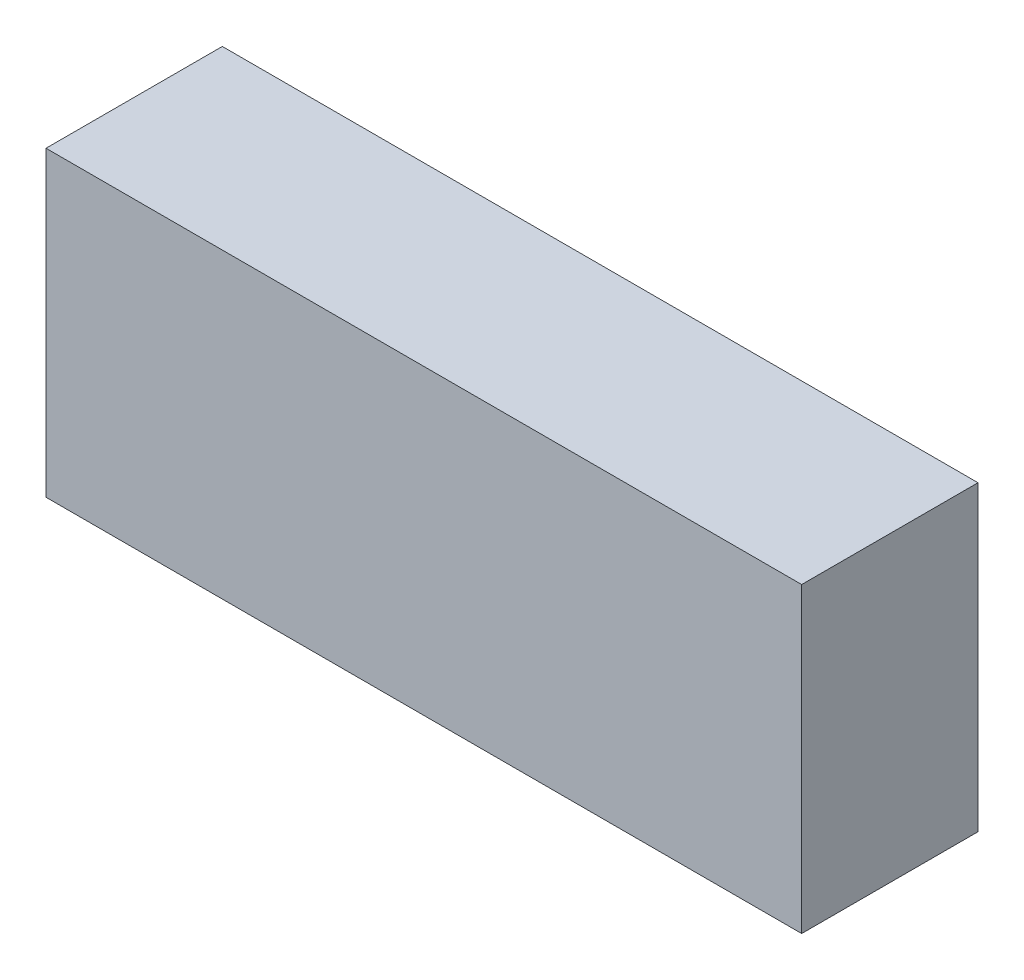
ISO-10303-21;
HEADER;
FILE_DESCRIPTION(('STEP AP214'),'2;1');
FILE_NAME('part.step','',(''),(''),'','','');
FILE_SCHEMA(('AUTOMOTIVE_DESIGN { 1 0 10303 214 1 1 1 1 }'));
ENDSEC;
DATA;
#1=APPLICATION_CONTEXT('core data for automotive mechanical design processes');
#2=APPLICATION_PROTOCOL_DEFINITION('international standard','automotive_design',2000,#1);
#3=PRODUCT_CONTEXT('',#1,'mechanical');
#4=PRODUCT('Part','Part','',(#3));
#5=PRODUCT_RELATED_PRODUCT_CATEGORY('part','',(#4));
#6=PRODUCT_DEFINITION_FORMATION('','',#4);
#7=PRODUCT_DEFINITION_CONTEXT('part definition',#1,'design');
#8=PRODUCT_DEFINITION('design','',#6,#7);
#9=PRODUCT_DEFINITION_SHAPE('','',#8);
#10=(LENGTH_UNIT() NAMED_UNIT(*) SI_UNIT(.MILLI.,.METRE.));
#11=(NAMED_UNIT(*) PLANE_ANGLE_UNIT() SI_UNIT($,.RADIAN.));
#12=(NAMED_UNIT(*) SI_UNIT($,.STERADIAN.) SOLID_ANGLE_UNIT());
#13=UNCERTAINTY_MEASURE_WITH_UNIT(LENGTH_MEASURE(1.E-05),#10,'distance_accuracy_value','');
#14=(GEOMETRIC_REPRESENTATION_CONTEXT(3) GLOBAL_UNCERTAINTY_ASSIGNED_CONTEXT((#13)) GLOBAL_UNIT_ASSIGNED_CONTEXT((#10,
#11,#12)) REPRESENTATION_CONTEXT('',''));
#15=CARTESIAN_POINT('',(0.,0.,0.));
#16=DIRECTION('',(0.,0.,1.));
#17=DIRECTION('',(1.,0.,0.));
#18=AXIS2_PLACEMENT_3D('',#15,#16,#17);
#19=CARTESIAN_POINT('',(-3.81,1.52400254,1.778));
#20=DIRECTION('',(0.,0.,1.));
#21=DIRECTION('',(1.,0.,0.));
#22=AXIS2_PLACEMENT_3D('',#19,#20,#21);
#23=PLANE('',#22);
#24=DIRECTION('',(0.,1.,0.));
#25=VECTOR('',#24,1.);
#26=CARTESIAN_POINT('',(3.81,1.52400254,1.778));
#27=LINE('',#26,#25);
#28=CARTESIAN_POINT('',(3.81,1.52400254,1.778));
#29=VERTEX_POINT('',#28);
#30=CARTESIAN_POINT('',(3.81,-1.52400254,1.778));
#31=VERTEX_POINT('',#30);
#32=EDGE_CURVE('E53',#29,#31,#27,.F.);
#33=ORIENTED_EDGE('',*,*,#32,.F.);
#34=DIRECTION('',(1.,0.,0.));
#35=VECTOR('',#34,1.);
#36=CARTESIAN_POINT('',(-3.81,1.52400254,1.778));
#37=LINE('',#36,#35);
#38=CARTESIAN_POINT('',(-3.81,1.52400254,1.778));
#39=VERTEX_POINT('',#38);
#40=EDGE_CURVE('E68',#39,#29,#37,.T.);
#41=ORIENTED_EDGE('',*,*,#40,.F.);
#42=DIRECTION('',(0.,1.,0.));
#43=VECTOR('',#42,1.);
#44=CARTESIAN_POINT('',(-3.81,-1.52400254,1.778));
#45=LINE('',#44,#43);
#46=CARTESIAN_POINT('',(-3.81,-1.52400254,1.778));
#47=VERTEX_POINT('',#46);
#48=EDGE_CURVE('E20',#47,#39,#45,.T.);
#49=ORIENTED_EDGE('',*,*,#48,.F.);
#50=DIRECTION('',(1.,0.,0.));
#51=VECTOR('',#50,1.);
#52=CARTESIAN_POINT('',(3.81,-1.52400254,1.778));
#53=LINE('',#52,#51);
#54=EDGE_CURVE('E58',#31,#47,#53,.F.);
#55=ORIENTED_EDGE('',*,*,#54,.F.);
#56=EDGE_LOOP('',(#33,#41,#49,#55));
#57=FACE_BOUND('',#56,.T.);
#58=ADVANCED_FACE('F17',(#57),#23,.T.);
#59=CARTESIAN_POINT('',(-3.81,-1.52400254,0.));
#60=DIRECTION('',(-1.,0.,0.));
#61=DIRECTION('',(0.,0.,1.));
#62=AXIS2_PLACEMENT_3D('',#59,#60,#61);
#63=PLANE('',#62);
#64=DIRECTION('',(0.,0.,1.));
#65=VECTOR('',#64,1.);
#66=CARTESIAN_POINT('',(-3.81,1.52400254,0.));
#67=LINE('',#66,#65);
#68=CARTESIAN_POINT('',(-3.81,1.52400254,0.));
#69=VERTEX_POINT('',#68);
#70=EDGE_CURVE('E79',#69,#39,#67,.T.);
#71=ORIENTED_EDGE('',*,*,#70,.F.);
#72=DIRECTION('',(0.,1.,0.));
#73=VECTOR('',#72,1.);
#74=CARTESIAN_POINT('',(-3.81,1.52400254,0.));
#75=LINE('',#74,#73);
#76=CARTESIAN_POINT('',(-3.81,-1.52400254,0.));
#77=VERTEX_POINT('',#76);
#78=EDGE_CURVE('E74',#69,#77,#75,.F.);
#79=ORIENTED_EDGE('',*,*,#78,.T.);
#80=DIRECTION('',(0.,0.,-1.));
#81=VECTOR('',#80,1.);
#82=CARTESIAN_POINT('',(-3.81,-1.52400254,0.));
#83=LINE('',#82,#81);
#84=EDGE_CURVE('E63',#47,#77,#83,.T.);
#85=ORIENTED_EDGE('',*,*,#84,.F.);
#86=ORIENTED_EDGE('',*,*,#48,.T.);
#87=EDGE_LOOP('',(#71,#79,#85,#86));
#88=FACE_BOUND('',#87,.T.);
#89=ADVANCED_FACE('F73',(#88),#63,.T.);
#90=CARTESIAN_POINT('',(3.81,-1.52400254,0.));
#91=DIRECTION('',(0.,-1.,0.));
#92=DIRECTION('',(0.,0.,-1.));
#93=AXIS2_PLACEMENT_3D('',#90,#91,#92);
#94=PLANE('',#93);
#95=ORIENTED_EDGE('',*,*,#84,.T.);
#96=DIRECTION('',(1.,0.,0.));
#97=VECTOR('',#96,1.);
#98=CARTESIAN_POINT('',(-3.81,-1.52400254,0.));
#99=LINE('',#98,#97);
#100=CARTESIAN_POINT('',(3.81,-1.52400254,0.));
#101=VERTEX_POINT('',#100);
#102=EDGE_CURVE('E84',#77,#101,#99,.T.);
#103=ORIENTED_EDGE('',*,*,#102,.T.);
#104=DIRECTION('',(0.,0.,-1.));
#105=VECTOR('',#104,1.);
#106=CARTESIAN_POINT('',(3.81,-1.52400254,0.));
#107=LINE('',#106,#105);
#108=EDGE_CURVE('E65',#31,#101,#107,.T.);
#109=ORIENTED_EDGE('',*,*,#108,.F.);
#110=ORIENTED_EDGE('',*,*,#54,.T.);
#111=EDGE_LOOP('',(#95,#103,#109,#110));
#112=FACE_BOUND('',#111,.T.);
#113=ADVANCED_FACE('F60',(#112),#94,.T.);
#114=CARTESIAN_POINT('',(3.81,1.52400254,0.));
#115=DIRECTION('',(1.,0.,0.));
#116=DIRECTION('',(0.,0.,-1.));
#117=AXIS2_PLACEMENT_3D('',#114,#115,#116);
#118=PLANE('',#117);
#119=ORIENTED_EDGE('',*,*,#108,.T.);
#120=DIRECTION('',(0.,1.,0.));
#121=VECTOR('',#120,1.);
#122=CARTESIAN_POINT('',(3.81,1.52400254,0.));
#123=LINE('',#122,#121);
#124=CARTESIAN_POINT('',(3.81,1.52400254,0.));
#125=VERTEX_POINT('',#124);
#126=EDGE_CURVE('E26',#101,#125,#123,.T.);
#127=ORIENTED_EDGE('',*,*,#126,.T.);
#128=DIRECTION('',(0.,0.,1.));
#129=VECTOR('',#128,1.);
#130=CARTESIAN_POINT('',(3.81,1.52400254,0.));
#131=LINE('',#130,#129);
#132=EDGE_CURVE('E34',#29,#125,#131,.F.);
#133=ORIENTED_EDGE('',*,*,#132,.F.);
#134=ORIENTED_EDGE('',*,*,#32,.T.);
#135=EDGE_LOOP('',(#119,#127,#133,#134));
#136=FACE_BOUND('',#135,.T.);
#137=ADVANCED_FACE('F88',(#136),#118,.T.);
#138=CARTESIAN_POINT('',(-3.81,1.52400254,0.));
#139=DIRECTION('',(0.,1.,0.));
#140=DIRECTION('',(0.,0.,1.));
#141=AXIS2_PLACEMENT_3D('',#138,#139,#140);
#142=PLANE('',#141);
#143=ORIENTED_EDGE('',*,*,#132,.T.);
#144=DIRECTION('',(1.,0.,0.));
#145=VECTOR('',#144,1.);
#146=CARTESIAN_POINT('',(-3.81,1.52400254,0.));
#147=LINE('',#146,#145);
#148=EDGE_CURVE('E11',#125,#69,#147,.F.);
#149=ORIENTED_EDGE('',*,*,#148,.T.);
#150=ORIENTED_EDGE('',*,*,#70,.T.);
#151=ORIENTED_EDGE('',*,*,#40,.T.);
#152=EDGE_LOOP('',(#143,#149,#150,#151));
#153=FACE_BOUND('',#152,.T.);
#154=ADVANCED_FACE('F91',(#153),#142,.T.);
#155=CARTESIAN_POINT('',(-3.81,1.52400254,0.));
#156=DIRECTION('',(0.,0.,1.));
#157=DIRECTION('',(1.,0.,0.));
#158=AXIS2_PLACEMENT_3D('',#155,#156,#157);
#159=PLANE('',#158);
#160=ORIENTED_EDGE('',*,*,#126,.F.);
#161=ORIENTED_EDGE('',*,*,#102,.F.);
#162=ORIENTED_EDGE('',*,*,#78,.F.);
#163=ORIENTED_EDGE('',*,*,#148,.F.);
#164=EDGE_LOOP('',(#160,#161,#162,#163));
#165=FACE_BOUND('',#164,.T.);
#166=ADVANCED_FACE('F90',(#165),#159,.F.);
#167=CLOSED_SHELL('',(#58,#89,#113,#137,#154,#166));
#168=MANIFOLD_SOLID_BREP('B1',#167);
#169=ADVANCED_BREP_SHAPE_REPRESENTATION('',(#18,#168),#14);
#170=SHAPE_DEFINITION_REPRESENTATION(#9,#169);
ENDSEC;
END-ISO-10303-21;
